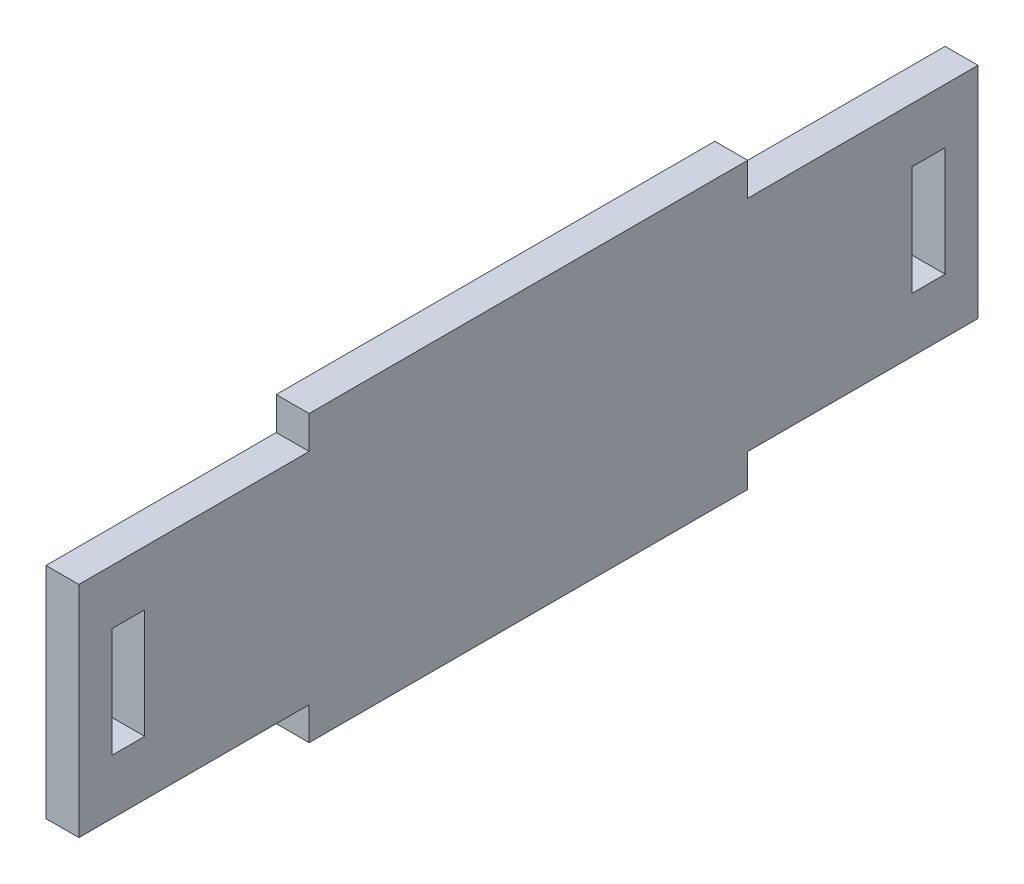
ISO-10303-21;
HEADER;
FILE_DESCRIPTION(('STEP AP214'),'2;1');
FILE_NAME('part.step','',(''),(''),'','','');
FILE_SCHEMA(('AUTOMOTIVE_DESIGN { 1 0 10303 214 1 1 1 1 }'));
ENDSEC;
DATA;
#1=APPLICATION_CONTEXT('core data for automotive mechanical design processes');
#2=APPLICATION_PROTOCOL_DEFINITION('international standard','automotive_design',2000,#1);
#3=PRODUCT_CONTEXT('',#1,'mechanical');
#4=PRODUCT('Part','Part','',(#3));
#5=PRODUCT_RELATED_PRODUCT_CATEGORY('part','',(#4));
#6=PRODUCT_DEFINITION_FORMATION('','',#4);
#7=PRODUCT_DEFINITION_CONTEXT('part definition',#1,'design');
#8=PRODUCT_DEFINITION('design','',#6,#7);
#9=PRODUCT_DEFINITION_SHAPE('','',#8);
#10=(LENGTH_UNIT() NAMED_UNIT(*) SI_UNIT(.MILLI.,.METRE.));
#11=(NAMED_UNIT(*) PLANE_ANGLE_UNIT() SI_UNIT($,.RADIAN.));
#12=(NAMED_UNIT(*) SI_UNIT($,.STERADIAN.) SOLID_ANGLE_UNIT());
#13=UNCERTAINTY_MEASURE_WITH_UNIT(LENGTH_MEASURE(1.E-05),#10,'distance_accuracy_value','');
#14=(GEOMETRIC_REPRESENTATION_CONTEXT(3) GLOBAL_UNCERTAINTY_ASSIGNED_CONTEXT((#13)) GLOBAL_UNIT_ASSIGNED_CONTEXT((#10,
#11,#12)) REPRESENTATION_CONTEXT('',''));
#15=CARTESIAN_POINT('',(0.,0.,0.));
#16=DIRECTION('',(0.,0.,1.));
#17=DIRECTION('',(1.,0.,0.));
#18=AXIS2_PLACEMENT_3D('',#15,#16,#17);
#19=CARTESIAN_POINT('',(3.,0.,0.));
#20=DIRECTION('',(-1.,0.,0.));
#21=DIRECTION('',(0.,0.,1.));
#22=AXIS2_PLACEMENT_3D('',#19,#20,#21);
#23=PLANE('',#22);
#24=DIRECTION('',(0.,1.,0.));
#25=VECTOR('',#24,1.);
#26=CARTESIAN_POINT('',(3.,15.,0.));
#27=LINE('',#26,#25);
#28=CARTESIAN_POINT('',(3.,5.,0.));
#29=VERTEX_POINT('',#28);
#30=CARTESIAN_POINT('',(3.,15.,0.));
#31=VERTEX_POINT('',#30);
#32=EDGE_CURVE('E225',#29,#31,#27,.T.);
#33=ORIENTED_EDGE('',*,*,#32,.F.);
#34=DIRECTION('',(0.,0.,-1.));
#35=VECTOR('',#34,1.);
#36=CARTESIAN_POINT('',(3.,5.,3.));
#37=LINE('',#36,#35);
#38=CARTESIAN_POINT('',(3.,5.,3.));
#39=VERTEX_POINT('',#38);
#40=EDGE_CURVE('E236',#39,#29,#37,.T.);
#41=ORIENTED_EDGE('',*,*,#40,.F.);
#42=DIRECTION('',(0.,-1.,0.));
#43=VECTOR('',#42,1.);
#44=CARTESIAN_POINT('',(3.,15.,3.));
#45=LINE('',#44,#43);
#46=CARTESIAN_POINT('',(3.,15.,3.));
#47=VERTEX_POINT('',#46);
#48=EDGE_CURVE('E232',#47,#39,#45,.T.);
#49=ORIENTED_EDGE('',*,*,#48,.F.);
#50=DIRECTION('',(0.,0.,1.));
#51=VECTOR('',#50,1.);
#52=CARTESIAN_POINT('',(3.,15.,3.));
#53=LINE('',#52,#51);
#54=EDGE_CURVE('E228',#31,#47,#53,.T.);
#55=ORIENTED_EDGE('',*,*,#54,.F.);
#56=EDGE_LOOP('',(#33,#41,#49,#55));
#57=FACE_BOUND('',#56,.T.);
#58=DIRECTION('',(0.,1.,0.));
#59=VECTOR('',#58,1.);
#60=CARTESIAN_POINT('',(3.,20.,-76.));
#61=LINE('',#60,#59);
#62=CARTESIAN_POINT('',(3.,0.,-76.));
#63=VERTEX_POINT('',#62);
#64=CARTESIAN_POINT('',(3.,20.,-76.));
#65=VERTEX_POINT('',#64);
#66=EDGE_CURVE('E268',#63,#65,#61,.T.);
#67=ORIENTED_EDGE('',*,*,#66,.T.);
#68=DIRECTION('',(0.,0.,1.));
#69=VECTOR('',#68,1.);
#70=CARTESIAN_POINT('',(3.,20.,-55.));
#71=LINE('',#70,#69);
#72=CARTESIAN_POINT('',(3.,20.,-55.));
#73=VERTEX_POINT('',#72);
#74=EDGE_CURVE('E272',#65,#73,#71,.T.);
#75=ORIENTED_EDGE('',*,*,#74,.T.);
#76=DIRECTION('',(0.,1.,0.));
#77=VECTOR('',#76,1.);
#78=CARTESIAN_POINT('',(3.,23.,-55.));
#79=LINE('',#78,#77);
#80=CARTESIAN_POINT('',(3.,23.,-55.));
#81=VERTEX_POINT('',#80);
#82=EDGE_CURVE('E276',#73,#81,#79,.T.);
#83=ORIENTED_EDGE('',*,*,#82,.T.);
#84=DIRECTION('',(0.,0.,1.));
#85=VECTOR('',#84,1.);
#86=CARTESIAN_POINT('',(3.,23.,-15.));
#87=LINE('',#86,#85);
#88=CARTESIAN_POINT('',(3.,23.,-15.));
#89=VERTEX_POINT('',#88);
#90=EDGE_CURVE('E279',#81,#89,#87,.T.);
#91=ORIENTED_EDGE('',*,*,#90,.T.);
#92=DIRECTION('',(0.,-1.,0.));
#93=VECTOR('',#92,1.);
#94=CARTESIAN_POINT('',(3.,20.,-15.));
#95=LINE('',#94,#93);
#96=CARTESIAN_POINT('',(3.,20.,-15.));
#97=VERTEX_POINT('',#96);
#98=EDGE_CURVE('E282',#89,#97,#95,.T.);
#99=ORIENTED_EDGE('',*,*,#98,.T.);
#100=DIRECTION('',(0.,0.,1.));
#101=VECTOR('',#100,1.);
#102=CARTESIAN_POINT('',(3.,20.,6.));
#103=LINE('',#102,#101);
#104=CARTESIAN_POINT('',(3.,20.,6.));
#105=VERTEX_POINT('',#104);
#106=EDGE_CURVE('E285',#97,#105,#103,.T.);
#107=ORIENTED_EDGE('',*,*,#106,.T.);
#108=DIRECTION('',(0.,-1.,0.));
#109=VECTOR('',#108,1.);
#110=CARTESIAN_POINT('',(3.,0.,6.));
#111=LINE('',#110,#109);
#112=CARTESIAN_POINT('',(3.,0.,6.));
#113=VERTEX_POINT('',#112);
#114=EDGE_CURVE('E288',#105,#113,#111,.T.);
#115=ORIENTED_EDGE('',*,*,#114,.T.);
#116=DIRECTION('',(0.,0.,-1.));
#117=VECTOR('',#116,1.);
#118=CARTESIAN_POINT('',(3.,0.,-15.));
#119=LINE('',#118,#117);
#120=CARTESIAN_POINT('',(3.,0.,-15.));
#121=VERTEX_POINT('',#120);
#122=EDGE_CURVE('E291',#113,#121,#119,.T.);
#123=ORIENTED_EDGE('',*,*,#122,.T.);
#124=DIRECTION('',(0.,-1.,0.));
#125=VECTOR('',#124,1.);
#126=CARTESIAN_POINT('',(3.,0.,-15.));
#127=LINE('',#126,#125);
#128=CARTESIAN_POINT('',(3.,-3.,-15.));
#129=VERTEX_POINT('',#128);
#130=EDGE_CURVE('E294',#121,#129,#127,.T.);
#131=ORIENTED_EDGE('',*,*,#130,.T.);
#132=DIRECTION('',(0.,0.,-1.));
#133=VECTOR('',#132,1.);
#134=CARTESIAN_POINT('',(3.,-3.,-55.));
#135=LINE('',#134,#133);
#136=CARTESIAN_POINT('',(3.,-3.,-55.));
#137=VERTEX_POINT('',#136);
#138=EDGE_CURVE('E297',#129,#137,#135,.T.);
#139=ORIENTED_EDGE('',*,*,#138,.T.);
#140=DIRECTION('',(0.,1.,0.));
#141=VECTOR('',#140,1.);
#142=CARTESIAN_POINT('',(3.,0.,-55.));
#143=LINE('',#142,#141);
#144=CARTESIAN_POINT('',(3.,0.,-55.));
#145=VERTEX_POINT('',#144);
#146=EDGE_CURVE('E300',#137,#145,#143,.T.);
#147=ORIENTED_EDGE('',*,*,#146,.T.);
#148=DIRECTION('',(0.,0.,-1.));
#149=VECTOR('',#148,1.);
#150=CARTESIAN_POINT('',(3.,0.,-76.));
#151=LINE('',#150,#149);
#152=EDGE_CURVE('E303',#145,#63,#151,.T.);
#153=ORIENTED_EDGE('',*,*,#152,.T.);
#154=EDGE_LOOP('',(#67,#75,#83,#91,#99,#107,#115,#123,#131,#139,#147,#153));
#155=FACE_BOUND('',#154,.T.);
#156=DIRECTION('',(0.,-1.,0.));
#157=VECTOR('',#156,1.);
#158=CARTESIAN_POINT('',(3.,15.,-70.));
#159=LINE('',#158,#157);
#160=CARTESIAN_POINT('',(3.,15.,-70.));
#161=VERTEX_POINT('',#160);
#162=CARTESIAN_POINT('',(3.,5.,-70.));
#163=VERTEX_POINT('',#162);
#164=EDGE_CURVE('E177',#161,#163,#159,.T.);
#165=ORIENTED_EDGE('',*,*,#164,.F.);
#166=DIRECTION('',(0.,0.,1.));
#167=VECTOR('',#166,1.);
#168=CARTESIAN_POINT('',(3.,15.,-73.));
#169=LINE('',#168,#167);
#170=CARTESIAN_POINT('',(3.,15.,-73.));
#171=VERTEX_POINT('',#170);
#172=EDGE_CURVE('E203',#171,#161,#169,.T.);
#173=ORIENTED_EDGE('',*,*,#172,.F.);
#174=DIRECTION('',(0.,1.,0.));
#175=VECTOR('',#174,1.);
#176=CARTESIAN_POINT('',(3.,15.,-73.));
#177=LINE('',#176,#175);
#178=CARTESIAN_POINT('',(3.,5.,-73.));
#179=VERTEX_POINT('',#178);
#180=EDGE_CURVE('E199',#179,#171,#177,.T.);
#181=ORIENTED_EDGE('',*,*,#180,.F.);
#182=DIRECTION('',(0.,0.,-1.));
#183=VECTOR('',#182,1.);
#184=CARTESIAN_POINT('',(3.,5.,-73.));
#185=LINE('',#184,#183);
#186=EDGE_CURVE('E186',#163,#179,#185,.T.);
#187=ORIENTED_EDGE('',*,*,#186,.F.);
#188=EDGE_LOOP('',(#165,#173,#181,#187));
#189=FACE_BOUND('',#188,.T.);
#190=ADVANCED_FACE('F39',(#57,#155,#189),#23,.F.);
#191=CARTESIAN_POINT('',(0.,0.,0.));
#192=DIRECTION('',(-1.,0.,0.));
#193=DIRECTION('',(0.,0.,1.));
#194=AXIS2_PLACEMENT_3D('',#191,#192,#193);
#195=PLANE('',#194);
#196=DIRECTION('',(0.,1.,0.));
#197=VECTOR('',#196,1.);
#198=CARTESIAN_POINT('',(0.,20.,-76.));
#199=LINE('',#198,#197);
#200=CARTESIAN_POINT('',(0.,0.,-76.));
#201=VERTEX_POINT('',#200);
#202=CARTESIAN_POINT('',(0.,20.,-76.));
#203=VERTEX_POINT('',#202);
#204=EDGE_CURVE('E267',#201,#203,#199,.T.);
#205=ORIENTED_EDGE('',*,*,#204,.F.);
#206=DIRECTION('',(0.,0.,-1.));
#207=VECTOR('',#206,1.);
#208=CARTESIAN_POINT('',(0.,0.,-76.));
#209=LINE('',#208,#207);
#210=CARTESIAN_POINT('',(0.,0.,-55.));
#211=VERTEX_POINT('',#210);
#212=EDGE_CURVE('E273',#211,#201,#209,.T.);
#213=ORIENTED_EDGE('',*,*,#212,.F.);
#214=DIRECTION('',(0.,1.,0.));
#215=VECTOR('',#214,1.);
#216=CARTESIAN_POINT('',(0.,0.,-55.));
#217=LINE('',#216,#215);
#218=CARTESIAN_POINT('',(0.,-3.,-55.));
#219=VERTEX_POINT('',#218);
#220=EDGE_CURVE('E337',#219,#211,#217,.T.);
#221=ORIENTED_EDGE('',*,*,#220,.F.);
#222=DIRECTION('',(0.,0.,-1.));
#223=VECTOR('',#222,1.);
#224=CARTESIAN_POINT('',(0.,-3.,-55.));
#225=LINE('',#224,#223);
#226=CARTESIAN_POINT('',(0.,-3.,-15.));
#227=VERTEX_POINT('',#226);
#228=EDGE_CURVE('E334',#227,#219,#225,.T.);
#229=ORIENTED_EDGE('',*,*,#228,.F.);
#230=DIRECTION('',(0.,-1.,0.));
#231=VECTOR('',#230,1.);
#232=CARTESIAN_POINT('',(0.,0.,-15.));
#233=LINE('',#232,#231);
#234=CARTESIAN_POINT('',(0.,0.,-15.));
#235=VERTEX_POINT('',#234);
#236=EDGE_CURVE('E331',#235,#227,#233,.T.);
#237=ORIENTED_EDGE('',*,*,#236,.F.);
#238=DIRECTION('',(0.,0.,-1.));
#239=VECTOR('',#238,1.);
#240=CARTESIAN_POINT('',(0.,0.,-15.));
#241=LINE('',#240,#239);
#242=CARTESIAN_POINT('',(0.,0.,6.));
#243=VERTEX_POINT('',#242);
#244=EDGE_CURVE('E328',#243,#235,#241,.T.);
#245=ORIENTED_EDGE('',*,*,#244,.F.);
#246=DIRECTION('',(0.,-1.,0.));
#247=VECTOR('',#246,1.);
#248=CARTESIAN_POINT('',(0.,0.,6.));
#249=LINE('',#248,#247);
#250=CARTESIAN_POINT('',(0.,20.,6.));
#251=VERTEX_POINT('',#250);
#252=EDGE_CURVE('E325',#251,#243,#249,.T.);
#253=ORIENTED_EDGE('',*,*,#252,.F.);
#254=DIRECTION('',(0.,0.,1.));
#255=VECTOR('',#254,1.);
#256=CARTESIAN_POINT('',(0.,20.,6.));
#257=LINE('',#256,#255);
#258=CARTESIAN_POINT('',(0.,20.,-15.));
#259=VERTEX_POINT('',#258);
#260=EDGE_CURVE('E322',#259,#251,#257,.T.);
#261=ORIENTED_EDGE('',*,*,#260,.F.);
#262=DIRECTION('',(0.,-1.,0.));
#263=VECTOR('',#262,1.);
#264=CARTESIAN_POINT('',(0.,20.,-15.));
#265=LINE('',#264,#263);
#266=CARTESIAN_POINT('',(0.,23.,-15.));
#267=VERTEX_POINT('',#266);
#268=EDGE_CURVE('E319',#267,#259,#265,.T.);
#269=ORIENTED_EDGE('',*,*,#268,.F.);
#270=DIRECTION('',(0.,0.,1.));
#271=VECTOR('',#270,1.);
#272=CARTESIAN_POINT('',(0.,23.,-15.));
#273=LINE('',#272,#271);
#274=CARTESIAN_POINT('',(0.,23.,-55.));
#275=VERTEX_POINT('',#274);
#276=EDGE_CURVE('E316',#275,#267,#273,.T.);
#277=ORIENTED_EDGE('',*,*,#276,.F.);
#278=DIRECTION('',(0.,1.,0.));
#279=VECTOR('',#278,1.);
#280=CARTESIAN_POINT('',(0.,23.,-55.));
#281=LINE('',#280,#279);
#282=CARTESIAN_POINT('',(0.,20.,-55.));
#283=VERTEX_POINT('',#282);
#284=EDGE_CURVE('E313',#283,#275,#281,.T.);
#285=ORIENTED_EDGE('',*,*,#284,.F.);
#286=DIRECTION('',(0.,0.,1.));
#287=VECTOR('',#286,1.);
#288=CARTESIAN_POINT('',(0.,20.,-55.));
#289=LINE('',#288,#287);
#290=EDGE_CURVE('E310',#203,#283,#289,.T.);
#291=ORIENTED_EDGE('',*,*,#290,.F.);
#292=EDGE_LOOP('',(#205,#213,#221,#229,#237,#245,#253,#261,#269,#277,#285,#291));
#293=FACE_BOUND('',#292,.T.);
#294=DIRECTION('',(0.,0.,-1.));
#295=VECTOR('',#294,1.);
#296=CARTESIAN_POINT('',(0.,5.,3.));
#297=LINE('',#296,#295);
#298=CARTESIAN_POINT('',(0.,5.,3.));
#299=VERTEX_POINT('',#298);
#300=CARTESIAN_POINT('',(0.,5.,0.));
#301=VERTEX_POINT('',#300);
#302=EDGE_CURVE('E229',#299,#301,#297,.T.);
#303=ORIENTED_EDGE('',*,*,#302,.T.);
#304=DIRECTION('',(0.,1.,0.));
#305=VECTOR('',#304,1.);
#306=CARTESIAN_POINT('',(0.,15.,0.));
#307=LINE('',#306,#305);
#308=CARTESIAN_POINT('',(0.,15.,0.));
#309=VERTEX_POINT('',#308);
#310=EDGE_CURVE('E195',#301,#309,#307,.T.);
#311=ORIENTED_EDGE('',*,*,#310,.T.);
#312=DIRECTION('',(0.,0.,1.));
#313=VECTOR('',#312,1.);
#314=CARTESIAN_POINT('',(0.,15.,3.));
#315=LINE('',#314,#313);
#316=CARTESIAN_POINT('',(0.,15.,3.));
#317=VERTEX_POINT('',#316);
#318=EDGE_CURVE('E243',#309,#317,#315,.T.);
#319=ORIENTED_EDGE('',*,*,#318,.T.);
#320=DIRECTION('',(0.,-1.,0.));
#321=VECTOR('',#320,1.);
#322=CARTESIAN_POINT('',(0.,15.,3.));
#323=LINE('',#322,#321);
#324=EDGE_CURVE('E247',#317,#299,#323,.T.);
#325=ORIENTED_EDGE('',*,*,#324,.T.);
#326=EDGE_LOOP('',(#303,#311,#319,#325));
#327=FACE_BOUND('',#326,.T.);
#328=DIRECTION('',(0.,0.,1.));
#329=VECTOR('',#328,1.);
#330=CARTESIAN_POINT('',(0.,15.,-73.));
#331=LINE('',#330,#329);
#332=CARTESIAN_POINT('',(0.,15.,-73.));
#333=VERTEX_POINT('',#332);
#334=CARTESIAN_POINT('',(0.,15.,-70.));
#335=VERTEX_POINT('',#334);
#336=EDGE_CURVE('E187',#333,#335,#331,.T.);
#337=ORIENTED_EDGE('',*,*,#336,.T.);
#338=DIRECTION('',(0.,-1.,0.));
#339=VECTOR('',#338,1.);
#340=CARTESIAN_POINT('',(0.,15.,-70.));
#341=LINE('',#340,#339);
#342=CARTESIAN_POINT('',(0.,5.,-70.));
#343=VERTEX_POINT('',#342);
#344=EDGE_CURVE('E63',#335,#343,#341,.T.);
#345=ORIENTED_EDGE('',*,*,#344,.T.);
#346=DIRECTION('',(0.,0.,-1.));
#347=VECTOR('',#346,1.);
#348=CARTESIAN_POINT('',(0.,5.,-73.));
#349=LINE('',#348,#347);
#350=CARTESIAN_POINT('',(0.,5.,-73.));
#351=VERTEX_POINT('',#350);
#352=EDGE_CURVE('E193',#343,#351,#349,.T.);
#353=ORIENTED_EDGE('',*,*,#352,.T.);
#354=DIRECTION('',(0.,1.,0.));
#355=VECTOR('',#354,1.);
#356=CARTESIAN_POINT('',(0.,15.,-73.));
#357=LINE('',#356,#355);
#358=EDGE_CURVE('E212',#351,#333,#357,.T.);
#359=ORIENTED_EDGE('',*,*,#358,.T.);
#360=EDGE_LOOP('',(#337,#345,#353,#359));
#361=FACE_BOUND('',#360,.T.);
#362=ADVANCED_FACE('F392',(#293,#327,#361),#195,.T.);
#363=CARTESIAN_POINT('',(3.,20.,-76.));
#364=DIRECTION('',(0.,0.,1.));
#365=DIRECTION('',(1.,0.,0.));
#366=AXIS2_PLACEMENT_3D('',#363,#364,#365);
#367=PLANE('',#366);
#368=ORIENTED_EDGE('',*,*,#204,.T.);
#369=DIRECTION('',(-1.,0.,0.));
#370=VECTOR('',#369,1.);
#371=CARTESIAN_POINT('',(3.,20.,-76.));
#372=LINE('',#371,#370);
#373=EDGE_CURVE('E11',#65,#203,#372,.T.);
#374=ORIENTED_EDGE('',*,*,#373,.F.);
#375=ORIENTED_EDGE('',*,*,#66,.F.);
#376=DIRECTION('',(-1.,0.,0.));
#377=VECTOR('',#376,1.);
#378=CARTESIAN_POINT('',(3.,0.,-76.));
#379=LINE('',#378,#377);
#380=EDGE_CURVE('E306',#63,#201,#379,.T.);
#381=ORIENTED_EDGE('',*,*,#380,.T.);
#382=EDGE_LOOP('',(#368,#374,#375,#381));
#383=FACE_BOUND('',#382,.T.);
#384=ADVANCED_FACE('F41',(#383),#367,.F.);
#385=CARTESIAN_POINT('',(3.,20.,-55.));
#386=DIRECTION('',(0.,-1.,0.));
#387=DIRECTION('',(0.,0.,-1.));
#388=AXIS2_PLACEMENT_3D('',#385,#386,#387);
#389=PLANE('',#388);
#390=ORIENTED_EDGE('',*,*,#290,.T.);
#391=DIRECTION('',(-1.,0.,0.));
#392=VECTOR('',#391,1.);
#393=CARTESIAN_POINT('',(3.,20.,-55.));
#394=LINE('',#393,#392);
#395=EDGE_CURVE('E48',#73,#283,#394,.T.);
#396=ORIENTED_EDGE('',*,*,#395,.F.);
#397=ORIENTED_EDGE('',*,*,#74,.F.);
#398=ORIENTED_EDGE('',*,*,#373,.T.);
#399=EDGE_LOOP('',(#390,#396,#397,#398));
#400=FACE_BOUND('',#399,.T.);
#401=ADVANCED_FACE('F409',(#400),#389,.F.);
#402=CARTESIAN_POINT('',(3.,23.,-55.));
#403=DIRECTION('',(0.,0.,1.));
#404=DIRECTION('',(1.,0.,0.));
#405=AXIS2_PLACEMENT_3D('',#402,#403,#404);
#406=PLANE('',#405);
#407=ORIENTED_EDGE('',*,*,#284,.T.);
#408=DIRECTION('',(-1.,0.,0.));
#409=VECTOR('',#408,1.);
#410=CARTESIAN_POINT('',(3.,23.,-55.));
#411=LINE('',#410,#409);
#412=EDGE_CURVE('E377',#81,#275,#411,.T.);
#413=ORIENTED_EDGE('',*,*,#412,.F.);
#414=ORIENTED_EDGE('',*,*,#82,.F.);
#415=ORIENTED_EDGE('',*,*,#395,.T.);
#416=EDGE_LOOP('',(#407,#413,#414,#415));
#417=FACE_BOUND('',#416,.T.);
#418=ADVANCED_FACE('F386',(#417),#406,.F.);
#419=CARTESIAN_POINT('',(3.,23.,-15.));
#420=DIRECTION('',(0.,-1.,0.));
#421=DIRECTION('',(0.,0.,-1.));
#422=AXIS2_PLACEMENT_3D('',#419,#420,#421);
#423=PLANE('',#422);
#424=ORIENTED_EDGE('',*,*,#276,.T.);
#425=DIRECTION('',(-1.,0.,0.));
#426=VECTOR('',#425,1.);
#427=CARTESIAN_POINT('',(3.,23.,-15.));
#428=LINE('',#427,#426);
#429=EDGE_CURVE('E373',#89,#267,#428,.T.);
#430=ORIENTED_EDGE('',*,*,#429,.F.);
#431=ORIENTED_EDGE('',*,*,#90,.F.);
#432=ORIENTED_EDGE('',*,*,#412,.T.);
#433=EDGE_LOOP('',(#424,#430,#431,#432));
#434=FACE_BOUND('',#433,.T.);
#435=ADVANCED_FACE('F398',(#434),#423,.F.);
#436=CARTESIAN_POINT('',(3.,20.,-15.));
#437=DIRECTION('',(0.,0.,-1.));
#438=DIRECTION('',(-1.,0.,0.));
#439=AXIS2_PLACEMENT_3D('',#436,#437,#438);
#440=PLANE('',#439);
#441=ORIENTED_EDGE('',*,*,#268,.T.);
#442=DIRECTION('',(-1.,0.,0.));
#443=VECTOR('',#442,1.);
#444=CARTESIAN_POINT('',(3.,20.,-15.));
#445=LINE('',#444,#443);
#446=EDGE_CURVE('E369',#97,#259,#445,.T.);
#447=ORIENTED_EDGE('',*,*,#446,.F.);
#448=ORIENTED_EDGE('',*,*,#98,.F.);
#449=ORIENTED_EDGE('',*,*,#429,.T.);
#450=EDGE_LOOP('',(#441,#447,#448,#449));
#451=FACE_BOUND('',#450,.T.);
#452=ADVANCED_FACE('F402',(#451),#440,.F.);
#453=CARTESIAN_POINT('',(3.,20.,6.));
#454=DIRECTION('',(0.,-1.,0.));
#455=DIRECTION('',(0.,0.,-1.));
#456=AXIS2_PLACEMENT_3D('',#453,#454,#455);
#457=PLANE('',#456);
#458=ORIENTED_EDGE('',*,*,#260,.T.);
#459=DIRECTION('',(-1.,0.,0.));
#460=VECTOR('',#459,1.);
#461=CARTESIAN_POINT('',(3.,20.,6.));
#462=LINE('',#461,#460);
#463=EDGE_CURVE('E365',#105,#251,#462,.T.);
#464=ORIENTED_EDGE('',*,*,#463,.F.);
#465=ORIENTED_EDGE('',*,*,#106,.F.);
#466=ORIENTED_EDGE('',*,*,#446,.T.);
#467=EDGE_LOOP('',(#458,#464,#465,#466));
#468=FACE_BOUND('',#467,.T.);
#469=ADVANCED_FACE('F442',(#468),#457,.F.);
#470=CARTESIAN_POINT('',(3.,0.,6.));
#471=DIRECTION('',(0.,0.,-1.));
#472=DIRECTION('',(-1.,0.,0.));
#473=AXIS2_PLACEMENT_3D('',#470,#471,#472);
#474=PLANE('',#473);
#475=ORIENTED_EDGE('',*,*,#252,.T.);
#476=DIRECTION('',(-1.,0.,0.));
#477=VECTOR('',#476,1.);
#478=CARTESIAN_POINT('',(3.,0.,6.));
#479=LINE('',#478,#477);
#480=EDGE_CURVE('E361',#113,#243,#479,.T.);
#481=ORIENTED_EDGE('',*,*,#480,.F.);
#482=ORIENTED_EDGE('',*,*,#114,.F.);
#483=ORIENTED_EDGE('',*,*,#463,.T.);
#484=EDGE_LOOP('',(#475,#481,#482,#483));
#485=FACE_BOUND('',#484,.T.);
#486=ADVANCED_FACE('F440',(#485),#474,.F.);
#487=CARTESIAN_POINT('',(3.,0.,-15.));
#488=DIRECTION('',(0.,1.,0.));
#489=DIRECTION('',(0.,0.,1.));
#490=AXIS2_PLACEMENT_3D('',#487,#488,#489);
#491=PLANE('',#490);
#492=ORIENTED_EDGE('',*,*,#244,.T.);
#493=DIRECTION('',(-1.,0.,0.));
#494=VECTOR('',#493,1.);
#495=CARTESIAN_POINT('',(3.,0.,-15.));
#496=LINE('',#495,#494);
#497=EDGE_CURVE('E357',#121,#235,#496,.T.);
#498=ORIENTED_EDGE('',*,*,#497,.F.);
#499=ORIENTED_EDGE('',*,*,#122,.F.);
#500=ORIENTED_EDGE('',*,*,#480,.T.);
#501=EDGE_LOOP('',(#492,#498,#499,#500));
#502=FACE_BOUND('',#501,.T.);
#503=ADVANCED_FACE('F436',(#502),#491,.F.);
#504=CARTESIAN_POINT('',(3.,0.,-15.));
#505=DIRECTION('',(0.,0.,-1.));
#506=DIRECTION('',(-1.,0.,0.));
#507=AXIS2_PLACEMENT_3D('',#504,#505,#506);
#508=PLANE('',#507);
#509=ORIENTED_EDGE('',*,*,#236,.T.);
#510=DIRECTION('',(-1.,0.,0.));
#511=VECTOR('',#510,1.);
#512=CARTESIAN_POINT('',(3.,-3.,-15.));
#513=LINE('',#512,#511);
#514=EDGE_CURVE('E353',#129,#227,#513,.T.);
#515=ORIENTED_EDGE('',*,*,#514,.F.);
#516=ORIENTED_EDGE('',*,*,#130,.F.);
#517=ORIENTED_EDGE('',*,*,#497,.T.);
#518=EDGE_LOOP('',(#509,#515,#516,#517));
#519=FACE_BOUND('',#518,.T.);
#520=ADVANCED_FACE('F431',(#519),#508,.F.);
#521=CARTESIAN_POINT('',(3.,-3.,-55.));
#522=DIRECTION('',(0.,1.,0.));
#523=DIRECTION('',(0.,0.,1.));
#524=AXIS2_PLACEMENT_3D('',#521,#522,#523);
#525=PLANE('',#524);
#526=ORIENTED_EDGE('',*,*,#228,.T.);
#527=DIRECTION('',(-1.,0.,0.));
#528=VECTOR('',#527,1.);
#529=CARTESIAN_POINT('',(3.,-3.,-55.));
#530=LINE('',#529,#528);
#531=EDGE_CURVE('E349',#137,#219,#530,.T.);
#532=ORIENTED_EDGE('',*,*,#531,.F.);
#533=ORIENTED_EDGE('',*,*,#138,.F.);
#534=ORIENTED_EDGE('',*,*,#514,.T.);
#535=EDGE_LOOP('',(#526,#532,#533,#534));
#536=FACE_BOUND('',#535,.T.);
#537=ADVANCED_FACE('F425',(#536),#525,.F.);
#538=CARTESIAN_POINT('',(3.,0.,-55.));
#539=DIRECTION('',(0.,0.,1.));
#540=DIRECTION('',(1.,0.,0.));
#541=AXIS2_PLACEMENT_3D('',#538,#539,#540);
#542=PLANE('',#541);
#543=ORIENTED_EDGE('',*,*,#220,.T.);
#544=DIRECTION('',(-1.,0.,0.));
#545=VECTOR('',#544,1.);
#546=CARTESIAN_POINT('',(3.,0.,-55.));
#547=LINE('',#546,#545);
#548=EDGE_CURVE('E345',#145,#211,#547,.T.);
#549=ORIENTED_EDGE('',*,*,#548,.F.);
#550=ORIENTED_EDGE('',*,*,#146,.F.);
#551=ORIENTED_EDGE('',*,*,#531,.T.);
#552=EDGE_LOOP('',(#543,#549,#550,#551));
#553=FACE_BOUND('',#552,.T.);
#554=ADVANCED_FACE('F421',(#553),#542,.F.);
#555=CARTESIAN_POINT('',(3.,0.,-76.));
#556=DIRECTION('',(0.,1.,0.));
#557=DIRECTION('',(0.,0.,1.));
#558=AXIS2_PLACEMENT_3D('',#555,#556,#557);
#559=PLANE('',#558);
#560=ORIENTED_EDGE('',*,*,#212,.T.);
#561=ORIENTED_EDGE('',*,*,#380,.F.);
#562=ORIENTED_EDGE('',*,*,#152,.F.);
#563=ORIENTED_EDGE('',*,*,#548,.T.);
#564=EDGE_LOOP('',(#560,#561,#562,#563));
#565=FACE_BOUND('',#564,.T.);
#566=ADVANCED_FACE('F416',(#565),#559,.F.);
#567=CARTESIAN_POINT('',(3.,15.,0.));
#568=DIRECTION('',(0.,0.,1.));
#569=DIRECTION('',(0.,-1.,0.));
#570=AXIS2_PLACEMENT_3D('',#567,#568,#569);
#571=PLANE('',#570);
#572=ORIENTED_EDGE('',*,*,#310,.F.);
#573=DIRECTION('',(-1.,0.,0.));
#574=VECTOR('',#573,1.);
#575=CARTESIAN_POINT('',(3.,5.,0.));
#576=LINE('',#575,#574);
#577=EDGE_CURVE('E239',#29,#301,#576,.T.);
#578=ORIENTED_EDGE('',*,*,#577,.F.);
#579=ORIENTED_EDGE('',*,*,#32,.T.);
#580=DIRECTION('',(-1.,0.,0.));
#581=VECTOR('',#580,1.);
#582=CARTESIAN_POINT('',(3.,15.,0.));
#583=LINE('',#582,#581);
#584=EDGE_CURVE('E263',#31,#309,#583,.T.);
#585=ORIENTED_EDGE('',*,*,#584,.T.);
#586=EDGE_LOOP('',(#572,#578,#579,#585));
#587=FACE_BOUND('',#586,.T.);
#588=ADVANCED_FACE('F460',(#587),#571,.T.);
#589=CARTESIAN_POINT('',(3.,15.,3.));
#590=DIRECTION('',(0.,-1.,0.));
#591=DIRECTION('',(0.,0.,-1.));
#592=AXIS2_PLACEMENT_3D('',#589,#590,#591);
#593=PLANE('',#592);
#594=ORIENTED_EDGE('',*,*,#318,.F.);
#595=ORIENTED_EDGE('',*,*,#584,.F.);
#596=ORIENTED_EDGE('',*,*,#54,.T.);
#597=DIRECTION('',(-1.,0.,0.));
#598=VECTOR('',#597,1.);
#599=CARTESIAN_POINT('',(3.,15.,3.));
#600=LINE('',#599,#598);
#601=EDGE_CURVE('E260',#47,#317,#600,.T.);
#602=ORIENTED_EDGE('',*,*,#601,.T.);
#603=EDGE_LOOP('',(#594,#595,#596,#602));
#604=FACE_BOUND('',#603,.T.);
#605=ADVANCED_FACE('F498',(#604),#593,.T.);
#606=CARTESIAN_POINT('',(3.,15.,3.));
#607=DIRECTION('',(0.,0.,-1.));
#608=DIRECTION('',(0.,1.,0.));
#609=AXIS2_PLACEMENT_3D('',#606,#607,#608);
#610=PLANE('',#609);
#611=ORIENTED_EDGE('',*,*,#324,.F.);
#612=ORIENTED_EDGE('',*,*,#601,.F.);
#613=ORIENTED_EDGE('',*,*,#48,.T.);
#614=DIRECTION('',(-1.,0.,0.));
#615=VECTOR('',#614,1.);
#616=CARTESIAN_POINT('',(3.,5.,3.));
#617=LINE('',#616,#615);
#618=EDGE_CURVE('E257',#39,#299,#617,.T.);
#619=ORIENTED_EDGE('',*,*,#618,.T.);
#620=EDGE_LOOP('',(#611,#612,#613,#619));
#621=FACE_BOUND('',#620,.T.);
#622=ADVANCED_FACE('F505',(#621),#610,.T.);
#623=CARTESIAN_POINT('',(3.,5.,3.));
#624=DIRECTION('',(0.,1.,0.));
#625=DIRECTION('',(0.,0.,1.));
#626=AXIS2_PLACEMENT_3D('',#623,#624,#625);
#627=PLANE('',#626);
#628=ORIENTED_EDGE('',*,*,#302,.F.);
#629=ORIENTED_EDGE('',*,*,#618,.F.);
#630=ORIENTED_EDGE('',*,*,#40,.T.);
#631=ORIENTED_EDGE('',*,*,#577,.T.);
#632=EDGE_LOOP('',(#628,#629,#630,#631));
#633=FACE_BOUND('',#632,.T.);
#634=ADVANCED_FACE('F512',(#633),#627,.T.);
#635=CARTESIAN_POINT('',(3.,15.,-70.));
#636=DIRECTION('',(0.,0.,-1.));
#637=DIRECTION('',(-1.,0.,0.));
#638=AXIS2_PLACEMENT_3D('',#635,#636,#637);
#639=PLANE('',#638);
#640=ORIENTED_EDGE('',*,*,#344,.F.);
#641=DIRECTION('',(-1.,0.,0.));
#642=VECTOR('',#641,1.);
#643=CARTESIAN_POINT('',(3.,15.,-70.));
#644=LINE('',#643,#642);
#645=EDGE_CURVE('E181',#161,#335,#644,.T.);
#646=ORIENTED_EDGE('',*,*,#645,.F.);
#647=ORIENTED_EDGE('',*,*,#164,.T.);
#648=DIRECTION('',(-1.,0.,0.));
#649=VECTOR('',#648,1.);
#650=CARTESIAN_POINT('',(3.,5.,-70.));
#651=LINE('',#650,#649);
#652=EDGE_CURVE('E180',#163,#343,#651,.T.);
#653=ORIENTED_EDGE('',*,*,#652,.T.);
#654=EDGE_LOOP('',(#640,#646,#647,#653));
#655=FACE_BOUND('',#654,.T.);
#656=ADVANCED_FACE('F179',(#655),#639,.T.);
#657=CARTESIAN_POINT('',(3.,5.,-73.));
#658=DIRECTION('',(0.,1.,0.));
#659=DIRECTION('',(0.,0.,1.));
#660=AXIS2_PLACEMENT_3D('',#657,#658,#659);
#661=PLANE('',#660);
#662=ORIENTED_EDGE('',*,*,#352,.F.);
#663=ORIENTED_EDGE('',*,*,#652,.F.);
#664=ORIENTED_EDGE('',*,*,#186,.T.);
#665=DIRECTION('',(-1.,0.,0.));
#666=VECTOR('',#665,1.);
#667=CARTESIAN_POINT('',(3.,5.,-73.));
#668=LINE('',#667,#666);
#669=EDGE_CURVE('E196',#179,#351,#668,.T.);
#670=ORIENTED_EDGE('',*,*,#669,.T.);
#671=EDGE_LOOP('',(#662,#663,#664,#670));
#672=FACE_BOUND('',#671,.T.);
#673=ADVANCED_FACE('F190',(#672),#661,.T.);
#674=CARTESIAN_POINT('',(3.,15.,-73.));
#675=DIRECTION('',(0.,0.,1.));
#676=DIRECTION('',(1.,0.,0.));
#677=AXIS2_PLACEMENT_3D('',#674,#675,#676);
#678=PLANE('',#677);
#679=ORIENTED_EDGE('',*,*,#358,.F.);
#680=ORIENTED_EDGE('',*,*,#669,.F.);
#681=ORIENTED_EDGE('',*,*,#180,.T.);
#682=DIRECTION('',(-1.,0.,0.));
#683=VECTOR('',#682,1.);
#684=CARTESIAN_POINT('',(3.,15.,-73.));
#685=LINE('',#684,#683);
#686=EDGE_CURVE('E55',#171,#333,#685,.T.);
#687=ORIENTED_EDGE('',*,*,#686,.T.);
#688=EDGE_LOOP('',(#679,#680,#681,#687));
#689=FACE_BOUND('',#688,.T.);
#690=ADVANCED_FACE('F533',(#689),#678,.T.);
#691=CARTESIAN_POINT('',(3.,15.,-73.));
#692=DIRECTION('',(0.,-1.,0.));
#693=DIRECTION('',(0.,0.,-1.));
#694=AXIS2_PLACEMENT_3D('',#691,#692,#693);
#695=PLANE('',#694);
#696=ORIENTED_EDGE('',*,*,#336,.F.);
#697=ORIENTED_EDGE('',*,*,#686,.F.);
#698=ORIENTED_EDGE('',*,*,#172,.T.);
#699=ORIENTED_EDGE('',*,*,#645,.T.);
#700=EDGE_LOOP('',(#696,#697,#698,#699));
#701=FACE_BOUND('',#700,.T.);
#702=ADVANCED_FACE('F540',(#701),#695,.T.);
#703=CLOSED_SHELL('',(#190,#362,#384,#401,#418,#435,#452,#469,#486,#503,#520,#537,#554,#566,
#588,#605,#622,#634,#656,#673,#690,#702));
#704=MANIFOLD_SOLID_BREP('B2',#703);
#705=ADVANCED_BREP_SHAPE_REPRESENTATION('',(#18,#704),#14);
#706=SHAPE_DEFINITION_REPRESENTATION(#9,#705);
ENDSEC;
END-ISO-10303-21;
